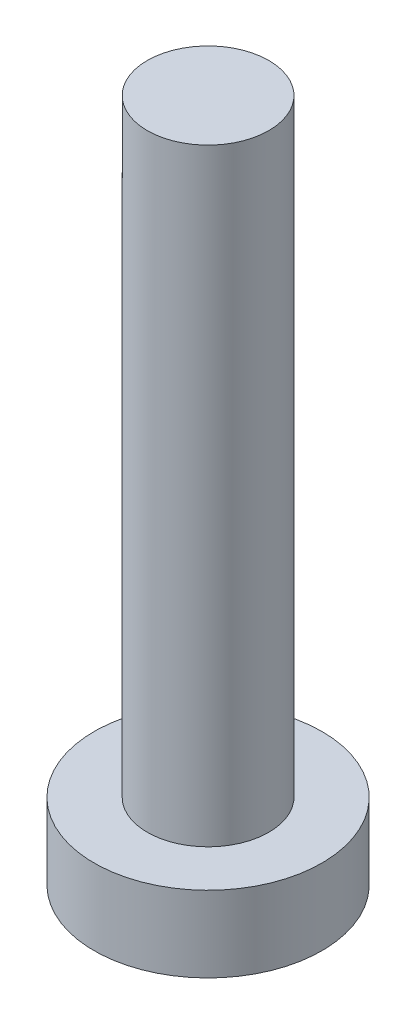
ISO-10303-21;
HEADER;
FILE_DESCRIPTION(('STEP AP214'),'2;1');
FILE_NAME('part.step','',(''),(''),'','','');
FILE_SCHEMA(('AUTOMOTIVE_DESIGN { 1 0 10303 214 1 1 1 1 }'));
ENDSEC;
DATA;
#1=APPLICATION_CONTEXT('core data for automotive mechanical design processes');
#2=APPLICATION_PROTOCOL_DEFINITION('international standard','automotive_design',2000,#1);
#3=PRODUCT_CONTEXT('',#1,'mechanical');
#4=PRODUCT('Part','Part','',(#3));
#5=PRODUCT_RELATED_PRODUCT_CATEGORY('part','',(#4));
#6=PRODUCT_DEFINITION_FORMATION('','',#4);
#7=PRODUCT_DEFINITION_CONTEXT('part definition',#1,'design');
#8=PRODUCT_DEFINITION('design','',#6,#7);
#9=PRODUCT_DEFINITION_SHAPE('','',#8);
#10=(LENGTH_UNIT() NAMED_UNIT(*) SI_UNIT(.MILLI.,.METRE.));
#11=(NAMED_UNIT(*) PLANE_ANGLE_UNIT() SI_UNIT($,.RADIAN.));
#12=(NAMED_UNIT(*) SI_UNIT($,.STERADIAN.) SOLID_ANGLE_UNIT());
#13=UNCERTAINTY_MEASURE_WITH_UNIT(LENGTH_MEASURE(1.E-05),#10,'distance_accuracy_value','');
#14=(GEOMETRIC_REPRESENTATION_CONTEXT(3) GLOBAL_UNCERTAINTY_ASSIGNED_CONTEXT((#13)) GLOBAL_UNIT_ASSIGNED_CONTEXT((#10,
#11,#12)) REPRESENTATION_CONTEXT('',''));
#15=CARTESIAN_POINT('',(0.,0.,0.));
#16=DIRECTION('',(0.,0.,1.));
#17=DIRECTION('',(1.,0.,0.));
#18=AXIS2_PLACEMENT_3D('',#15,#16,#17);
#19=CARTESIAN_POINT('',(0.,40.,0.));
#20=DIRECTION('',(0.,-1.,0.));
#21=DIRECTION('',(0.,0.,-1.));
#22=AXIS2_PLACEMENT_3D('',#19,#20,#21);
#23=CYLINDRICAL_SURFACE('',#22,4.);
#24=CARTESIAN_POINT('',(0.,40.,0.));
#25=DIRECTION('',(0.,1.,0.));
#26=DIRECTION('',(0.,0.,1.));
#27=AXIS2_PLACEMENT_3D('',#24,#25,#26);
#28=CIRCLE('',#27,4.);
#29=CARTESIAN_POINT('',(0.,40.,4.));
#30=VERTEX_POINT('',#29);
#31=EDGE_CURVE('E10',#30,#30,#28,.T.);
#32=ORIENTED_EDGE('',*,*,#31,.F.);
#33=EDGE_LOOP('',(#32));
#34=FACE_BOUND('',#33,.T.);
#35=CARTESIAN_POINT('',(0.,0.,0.));
#36=DIRECTION('',(0.,-1.,0.));
#37=DIRECTION('',(0.,0.,-1.));
#38=AXIS2_PLACEMENT_3D('',#35,#36,#37);
#39=CIRCLE('',#38,4.);
#40=CARTESIAN_POINT('',(0.,0.,-4.));
#41=VERTEX_POINT('',#40);
#42=EDGE_CURVE('E37',#41,#41,#39,.T.);
#43=ORIENTED_EDGE('',*,*,#42,.F.);
#44=EDGE_LOOP('',(#43));
#45=FACE_BOUND('',#44,.T.);
#46=ADVANCED_FACE('F31',(#34,#45),#23,.T.);
#47=CARTESIAN_POINT('',(0.,40.,0.));
#48=DIRECTION('',(0.,1.,0.));
#49=DIRECTION('',(0.,0.,1.));
#50=AXIS2_PLACEMENT_3D('',#47,#48,#49);
#51=PLANE('',#50);
#52=ORIENTED_EDGE('',*,*,#31,.T.);
#53=EDGE_LOOP('',(#52));
#54=FACE_BOUND('',#53,.T.);
#55=ADVANCED_FACE('F64',(#54),#51,.T.);
#56=CARTESIAN_POINT('',(0.,-5.,0.));
#57=DIRECTION('',(0.,1.,0.));
#58=DIRECTION('',(0.,0.,1.));
#59=AXIS2_PLACEMENT_3D('',#56,#57,#58);
#60=CYLINDRICAL_SURFACE('',#59,7.5);
#61=CARTESIAN_POINT('',(0.,-5.,0.));
#62=DIRECTION('',(0.,-1.,0.));
#63=DIRECTION('',(0.,0.,-1.));
#64=AXIS2_PLACEMENT_3D('',#61,#62,#63);
#65=CIRCLE('',#64,7.5);
#66=CARTESIAN_POINT('',(0.,-5.,-7.5));
#67=VERTEX_POINT('',#66);
#68=EDGE_CURVE('E41',#67,#67,#65,.T.);
#69=ORIENTED_EDGE('',*,*,#68,.F.);
#70=EDGE_LOOP('',(#69));
#71=FACE_BOUND('',#70,.T.);
#72=CARTESIAN_POINT('',(0.,0.,0.));
#73=DIRECTION('',(0.,-1.,0.));
#74=DIRECTION('',(0.,0.,-1.));
#75=AXIS2_PLACEMENT_3D('',#72,#73,#74);
#76=CIRCLE('',#75,7.5);
#77=CARTESIAN_POINT('',(0.,0.,-7.5));
#78=VERTEX_POINT('',#77);
#79=EDGE_CURVE('E45',#78,#78,#76,.T.);
#80=ORIENTED_EDGE('',*,*,#79,.T.);
#81=EDGE_LOOP('',(#80));
#82=FACE_BOUND('',#81,.T.);
#83=ADVANCED_FACE('F51',(#71,#82),#60,.T.);
#84=CARTESIAN_POINT('',(0.,-5.,0.));
#85=DIRECTION('',(0.,-1.,0.));
#86=DIRECTION('',(0.,0.,-1.));
#87=AXIS2_PLACEMENT_3D('',#84,#85,#86);
#88=PLANE('',#87);
#89=ORIENTED_EDGE('',*,*,#68,.T.);
#90=EDGE_LOOP('',(#89));
#91=FACE_BOUND('',#90,.T.);
#92=ADVANCED_FACE('F55',(#91),#88,.T.);
#93=CARTESIAN_POINT('',(0.,0.,0.));
#94=DIRECTION('',(0.,-1.,0.));
#95=DIRECTION('',(0.,0.,-1.));
#96=AXIS2_PLACEMENT_3D('',#93,#94,#95);
#97=PLANE('',#96);
#98=ORIENTED_EDGE('',*,*,#42,.T.);
#99=EDGE_LOOP('',(#98));
#100=FACE_BOUND('',#99,.T.);
#101=ORIENTED_EDGE('',*,*,#79,.F.);
#102=EDGE_LOOP('',(#101));
#103=FACE_BOUND('',#102,.T.);
#104=ADVANCED_FACE('F53',(#100,#103),#97,.F.);
#105=CLOSED_SHELL('',(#46,#55,#83,#92,#104));
#106=MANIFOLD_SOLID_BREP('B2',#105);
#107=ADVANCED_BREP_SHAPE_REPRESENTATION('',(#18,#106),#14);
#108=SHAPE_DEFINITION_REPRESENTATION(#9,#107);
ENDSEC;
END-ISO-10303-21;
